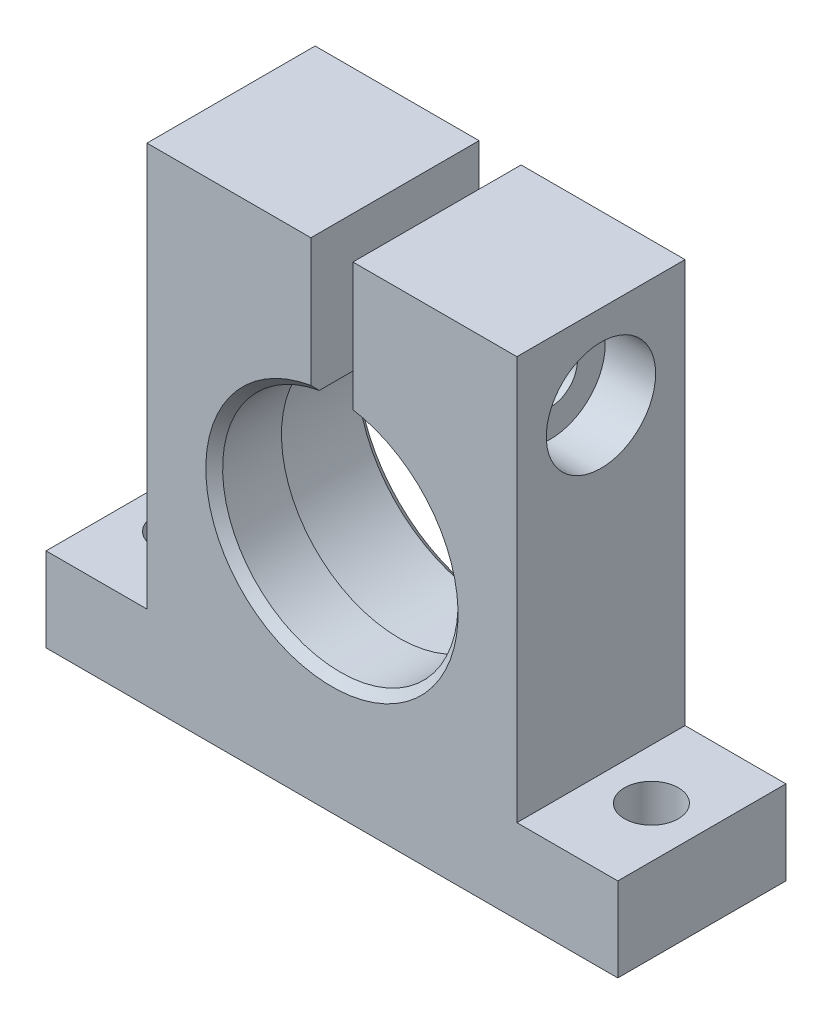
ISO-10303-21;
HEADER;
FILE_DESCRIPTION(('STEP AP214'),'2;1');
FILE_NAME('part.step','',(''),(''),'','','');
FILE_SCHEMA(('AUTOMOTIVE_DESIGN { 1 0 10303 214 1 1 1 1 }'));
ENDSEC;
DATA;
#1=APPLICATION_CONTEXT('core data for automotive mechanical design processes');
#2=APPLICATION_PROTOCOL_DEFINITION('international standard','automotive_design',2000,#1);
#3=PRODUCT_CONTEXT('',#1,'mechanical');
#4=PRODUCT('Part','Part','',(#3));
#5=PRODUCT_RELATED_PRODUCT_CATEGORY('part','',(#4));
#6=PRODUCT_DEFINITION_FORMATION('','',#4);
#7=PRODUCT_DEFINITION_CONTEXT('part definition',#1,'design');
#8=PRODUCT_DEFINITION('design','',#6,#7);
#9=PRODUCT_DEFINITION_SHAPE('','',#8);
#10=(LENGTH_UNIT() NAMED_UNIT(*) SI_UNIT(.MILLI.,.METRE.));
#11=(NAMED_UNIT(*) PLANE_ANGLE_UNIT() SI_UNIT($,.RADIAN.));
#12=(NAMED_UNIT(*) SI_UNIT($,.STERADIAN.) SOLID_ANGLE_UNIT());
#13=UNCERTAINTY_MEASURE_WITH_UNIT(LENGTH_MEASURE(1.E-05),#10,'distance_accuracy_value','');
#14=(GEOMETRIC_REPRESENTATION_CONTEXT(3) GLOBAL_UNCERTAINTY_ASSIGNED_CONTEXT((#13)) GLOBAL_UNIT_ASSIGNED_CONTEXT((#10,
#11,#12)) REPRESENTATION_CONTEXT('',''));
#15=CARTESIAN_POINT('',(0.,0.,0.));
#16=DIRECTION('',(0.,0.,1.));
#17=DIRECTION('',(1.,0.,0.));
#18=AXIS2_PLACEMENT_3D('',#15,#16,#17);
#19=CARTESIAN_POINT('',(11.,15.,5.));
#20=DIRECTION('',(0.,-1.,0.));
#21=DIRECTION('',(1.,0.,0.));
#22=AXIS2_PLACEMENT_3D('',#19,#20,#21);
#23=PLANE('',#22);
#24=DIRECTION('',(-1.,0.,0.));
#25=VECTOR('',#24,1.);
#26=CARTESIAN_POINT('',(11.,15.,5.));
#27=LINE('',#26,#25);
#28=CARTESIAN_POINT('',(-1.25,15.,5.));
#29=VERTEX_POINT('',#28);
#30=CARTESIAN_POINT('',(-11.,15.,5.));
#31=VERTEX_POINT('',#30);
#32=EDGE_CURVE('E387',#29,#31,#27,.T.);
#33=ORIENTED_EDGE('',*,*,#32,.F.);
#34=DIRECTION('',(0.,0.,1.));
#35=VECTOR('',#34,1.);
#36=CARTESIAN_POINT('',(-1.25,15.,-5.));
#37=LINE('',#36,#35);
#38=CARTESIAN_POINT('',(-1.25,15.,-5.));
#39=VERTEX_POINT('',#38);
#40=EDGE_CURVE('E172',#39,#29,#37,.T.);
#41=ORIENTED_EDGE('',*,*,#40,.F.);
#42=DIRECTION('',(-1.,0.,0.));
#43=VECTOR('',#42,1.);
#44=CARTESIAN_POINT('',(11.,15.,-5.));
#45=LINE('',#44,#43);
#46=CARTESIAN_POINT('',(-11.,15.,-5.));
#47=VERTEX_POINT('',#46);
#48=EDGE_CURVE('E179',#39,#47,#45,.T.);
#49=ORIENTED_EDGE('',*,*,#48,.T.);
#50=DIRECTION('',(0.,0.,-1.));
#51=VECTOR('',#50,1.);
#52=CARTESIAN_POINT('',(-11.,15.,5.));
#53=LINE('',#52,#51);
#54=EDGE_CURVE('E188',#31,#47,#53,.T.);
#55=ORIENTED_EDGE('',*,*,#54,.F.);
#56=EDGE_LOOP('',(#33,#41,#49,#55));
#57=FACE_BOUND('',#56,.T.);
#58=ADVANCED_FACE('F43',(#57),#23,.F.);
#59=CARTESIAN_POINT('',(-11.,-14.,5.));
#60=DIRECTION('',(1.,0.,0.));
#61=DIRECTION('',(0.,0.,-1.));
#62=AXIS2_PLACEMENT_3D('',#59,#60,#61);
#63=PLANE('',#62);
#64=CARTESIAN_POINT('',(-11.,10.,0.));
#65=DIRECTION('',(1.,0.,0.));
#66=DIRECTION('',(0.,0.,-1.));
#67=AXIS2_PLACEMENT_3D('',#64,#65,#66);
#68=CIRCLE('',#67,1.75);
#69=CARTESIAN_POINT('',(-11.,10.,-1.75));
#70=VERTEX_POINT('',#69);
#71=EDGE_CURVE('E201',#70,#70,#68,.T.);
#72=ORIENTED_EDGE('',*,*,#71,.T.);
#73=EDGE_LOOP('',(#72));
#74=FACE_BOUND('',#73,.T.);
#75=DIRECTION('',(0.,0.,-1.));
#76=VECTOR('',#75,1.);
#77=CARTESIAN_POINT('',(-11.,-9.,5.));
#78=LINE('',#77,#76);
#79=CARTESIAN_POINT('',(-11.,-9.,5.));
#80=VERTEX_POINT('',#79);
#81=CARTESIAN_POINT('',(-11.,-9.,-5.));
#82=VERTEX_POINT('',#81);
#83=EDGE_CURVE('E381',#80,#82,#78,.T.);
#84=ORIENTED_EDGE('',*,*,#83,.F.);
#85=DIRECTION('',(0.,-1.,0.));
#86=VECTOR('',#85,1.);
#87=CARTESIAN_POINT('',(-11.,-14.,5.));
#88=LINE('',#87,#86);
#89=EDGE_CURVE('E178',#31,#80,#88,.T.);
#90=ORIENTED_EDGE('',*,*,#89,.F.);
#91=ORIENTED_EDGE('',*,*,#54,.T.);
#92=DIRECTION('',(0.,-1.,0.));
#93=VECTOR('',#92,1.);
#94=CARTESIAN_POINT('',(-11.,-14.,-5.));
#95=LINE('',#94,#93);
#96=EDGE_CURVE('E382',#47,#82,#95,.T.);
#97=ORIENTED_EDGE('',*,*,#96,.T.);
#98=EDGE_LOOP('',(#84,#90,#91,#97));
#99=FACE_BOUND('',#98,.T.);
#100=ADVANCED_FACE('F275',(#74,#99),#63,.F.);
#101=CARTESIAN_POINT('',(11.,-14.,5.));
#102=DIRECTION('',(-1.,0.,0.));
#103=DIRECTION('',(0.,0.,1.));
#104=AXIS2_PLACEMENT_3D('',#101,#102,#103);
#105=PLANE('',#104);
#106=CARTESIAN_POINT('',(11.,10.,0.));
#107=DIRECTION('',(1.,0.,0.));
#108=DIRECTION('',(0.,0.,-1.));
#109=AXIS2_PLACEMENT_3D('',#106,#107,#108);
#110=CIRCLE('',#109,3.25);
#111=CARTESIAN_POINT('',(11.,10.,-3.25));
#112=VERTEX_POINT('',#111);
#113=EDGE_CURVE('E438',#112,#112,#110,.T.);
#114=ORIENTED_EDGE('',*,*,#113,.F.);
#115=EDGE_LOOP('',(#114));
#116=FACE_BOUND('',#115,.T.);
#117=DIRECTION('',(0.,0.,1.));
#118=VECTOR('',#117,1.);
#119=CARTESIAN_POINT('',(11.,-9.,5.));
#120=LINE('',#119,#118);
#121=CARTESIAN_POINT('',(11.,-9.,-5.));
#122=VERTEX_POINT('',#121);
#123=CARTESIAN_POINT('',(11.,-9.,5.));
#124=VERTEX_POINT('',#123);
#125=EDGE_CURVE('E370',#122,#124,#120,.T.);
#126=ORIENTED_EDGE('',*,*,#125,.F.);
#127=DIRECTION('',(0.,1.,0.));
#128=VECTOR('',#127,1.);
#129=CARTESIAN_POINT('',(11.,-14.,-5.));
#130=LINE('',#129,#128);
#131=CARTESIAN_POINT('',(11.,15.,-5.));
#132=VERTEX_POINT('',#131);
#133=EDGE_CURVE('E184',#122,#132,#130,.T.);
#134=ORIENTED_EDGE('',*,*,#133,.T.);
#135=DIRECTION('',(0.,0.,-1.));
#136=VECTOR('',#135,1.);
#137=CARTESIAN_POINT('',(11.,15.,5.));
#138=LINE('',#137,#136);
#139=CARTESIAN_POINT('',(11.,15.,5.));
#140=VERTEX_POINT('',#139);
#141=EDGE_CURVE('E177',#140,#132,#138,.T.);
#142=ORIENTED_EDGE('',*,*,#141,.F.);
#143=DIRECTION('',(0.,1.,0.));
#144=VECTOR('',#143,1.);
#145=CARTESIAN_POINT('',(11.,-14.,5.));
#146=LINE('',#145,#144);
#147=EDGE_CURVE('E385',#124,#140,#146,.T.);
#148=ORIENTED_EDGE('',*,*,#147,.F.);
#149=EDGE_LOOP('',(#126,#134,#142,#148));
#150=FACE_BOUND('',#149,.T.);
#151=ADVANCED_FACE('F272',(#116,#150),#105,.F.);
#152=CARTESIAN_POINT('',(11.,-14.,5.));
#153=DIRECTION('',(0.,1.,0.));
#154=DIRECTION('',(-1.,0.,0.));
#155=AXIS2_PLACEMENT_3D('',#152,#153,#154);
#156=PLANE('',#155);
#157=CARTESIAN_POINT('',(-14.,-14.,0.));
#158=DIRECTION('',(0.,1.,0.));
#159=DIRECTION('',(0.,0.,1.));
#160=AXIS2_PLACEMENT_3D('',#157,#158,#159);
#161=CIRCLE('',#160,1.6);
#162=CARTESIAN_POINT('',(-14.,-14.,1.6));
#163=VERTEX_POINT('',#162);
#164=EDGE_CURVE('E332',#163,#163,#161,.T.);
#165=ORIENTED_EDGE('',*,*,#164,.T.);
#166=EDGE_LOOP('',(#165));
#167=FACE_BOUND('',#166,.T.);
#168=CARTESIAN_POINT('',(14.,-14.,0.));
#169=DIRECTION('',(0.,1.,0.));
#170=DIRECTION('',(0.,0.,1.));
#171=AXIS2_PLACEMENT_3D('',#168,#169,#170);
#172=CIRCLE('',#171,1.6);
#173=CARTESIAN_POINT('',(14.,-14.,1.6));
#174=VERTEX_POINT('',#173);
#175=EDGE_CURVE('E338',#174,#174,#172,.T.);
#176=ORIENTED_EDGE('',*,*,#175,.T.);
#177=EDGE_LOOP('',(#176));
#178=FACE_BOUND('',#177,.T.);
#179=DIRECTION('',(1.,0.,0.));
#180=VECTOR('',#179,1.);
#181=CARTESIAN_POINT('',(11.,-14.,-5.));
#182=LINE('',#181,#180);
#183=CARTESIAN_POINT('',(-17.,-14.,-5.));
#184=VERTEX_POINT('',#183);
#185=CARTESIAN_POINT('',(17.,-14.,-5.));
#186=VERTEX_POINT('',#185);
#187=EDGE_CURVE('E390',#184,#186,#182,.T.);
#188=ORIENTED_EDGE('',*,*,#187,.T.);
#189=DIRECTION('',(0.,0.,1.));
#190=VECTOR('',#189,1.);
#191=CARTESIAN_POINT('',(17.,-14.,-5.));
#192=LINE('',#191,#190);
#193=CARTESIAN_POINT('',(17.,-14.,5.));
#194=VERTEX_POINT('',#193);
#195=EDGE_CURVE('E351',#186,#194,#192,.T.);
#196=ORIENTED_EDGE('',*,*,#195,.T.);
#197=DIRECTION('',(1.,0.,0.));
#198=VECTOR('',#197,1.);
#199=CARTESIAN_POINT('',(11.,-14.,5.));
#200=LINE('',#199,#198);
#201=CARTESIAN_POINT('',(-17.,-14.,5.));
#202=VERTEX_POINT('',#201);
#203=EDGE_CURVE('E182',#202,#194,#200,.T.);
#204=ORIENTED_EDGE('',*,*,#203,.F.);
#205=DIRECTION('',(0.,0.,-1.));
#206=VECTOR('',#205,1.);
#207=CARTESIAN_POINT('',(-17.,-14.,-5.));
#208=LINE('',#207,#206);
#209=EDGE_CURVE('E346',#202,#184,#208,.T.);
#210=ORIENTED_EDGE('',*,*,#209,.T.);
#211=EDGE_LOOP('',(#188,#196,#204,#210));
#212=FACE_BOUND('',#211,.T.);
#213=ADVANCED_FACE('F271',(#167,#178,#212),#156,.F.);
#214=CARTESIAN_POINT('',(1.25,15.,-5.));
#215=VERTEX_POINT('',#214);
#216=EDGE_CURVE('E160',#132,#215,#45,.T.);
#217=ORIENTED_EDGE('',*,*,#216,.T.);
#218=DIRECTION('',(0.,0.,1.));
#219=VECTOR('',#218,1.);
#220=CARTESIAN_POINT('',(1.25,15.,-5.));
#221=LINE('',#220,#219);
#222=CARTESIAN_POINT('',(1.25,15.,5.));
#223=VERTEX_POINT('',#222);
#224=EDGE_CURVE('E161',#215,#223,#221,.T.);
#225=ORIENTED_EDGE('',*,*,#224,.T.);
#226=EDGE_CURVE('E191',#140,#223,#27,.T.);
#227=ORIENTED_EDGE('',*,*,#226,.F.);
#228=ORIENTED_EDGE('',*,*,#141,.T.);
#229=EDGE_LOOP('',(#217,#225,#227,#228));
#230=FACE_BOUND('',#229,.T.);
#231=ADVANCED_FACE('F175',(#230),#23,.F.);
#232=CARTESIAN_POINT('',(0.,0.,5.));
#233=DIRECTION('',(0.,0.,1.));
#234=DIRECTION('',(1.,0.,0.));
#235=AXIS2_PLACEMENT_3D('',#232,#233,#234);
#236=PLANE('',#235);
#237=DIRECTION('',(0.,1.,0.));
#238=VECTOR('',#237,1.);
#239=CARTESIAN_POINT('',(1.25,6.88748865697795,5.));
#240=LINE('',#239,#238);
#241=CARTESIAN_POINT('',(1.25,7.39509972887451,5.));
#242=VERTEX_POINT('',#241);
#243=EDGE_CURVE('E168',#242,#223,#240,.T.);
#244=ORIENTED_EDGE('',*,*,#243,.F.);
#245=CARTESIAN_POINT('',(0.,0.,5.));
#246=DIRECTION('',(0.,0.,1.));
#247=DIRECTION('',(1.,0.,0.));
#248=AXIS2_PLACEMENT_3D('',#245,#246,#247);
#249=CIRCLE('',#248,7.49999999999999);
#250=CARTESIAN_POINT('',(-1.25,7.39509972887451,5.));
#251=VERTEX_POINT('',#250);
#252=EDGE_CURVE('E204',#242,#251,#249,.F.);
#253=ORIENTED_EDGE('',*,*,#252,.T.);
#254=DIRECTION('',(0.,-1.,0.));
#255=VECTOR('',#254,1.);
#256=CARTESIAN_POINT('',(-1.25,6.88748865697795,5.));
#257=LINE('',#256,#255);
#258=EDGE_CURVE('E417',#29,#251,#257,.T.);
#259=ORIENTED_EDGE('',*,*,#258,.F.);
#260=ORIENTED_EDGE('',*,*,#32,.T.);
#261=ORIENTED_EDGE('',*,*,#89,.T.);
#262=DIRECTION('',(-1.,0.,0.));
#263=VECTOR('',#262,1.);
#264=CARTESIAN_POINT('',(17.,-9.,5.));
#265=LINE('',#264,#263);
#266=CARTESIAN_POINT('',(-17.,-9.,5.));
#267=VERTEX_POINT('',#266);
#268=EDGE_CURVE('E358',#80,#267,#265,.T.);
#269=ORIENTED_EDGE('',*,*,#268,.T.);
#270=DIRECTION('',(0.,-1.,0.));
#271=VECTOR('',#270,1.);
#272=CARTESIAN_POINT('',(-17.,-9.,5.));
#273=LINE('',#272,#271);
#274=EDGE_CURVE('E367',#267,#202,#273,.T.);
#275=ORIENTED_EDGE('',*,*,#274,.T.);
#276=ORIENTED_EDGE('',*,*,#203,.T.);
#277=DIRECTION('',(0.,-1.,0.));
#278=VECTOR('',#277,1.);
#279=CARTESIAN_POINT('',(17.,-9.,5.));
#280=LINE('',#279,#278);
#281=CARTESIAN_POINT('',(17.,-9.,5.));
#282=VERTEX_POINT('',#281);
#283=EDGE_CURVE('E371',#282,#194,#280,.T.);
#284=ORIENTED_EDGE('',*,*,#283,.F.);
#285=EDGE_CURVE('E359',#282,#124,#265,.T.);
#286=ORIENTED_EDGE('',*,*,#285,.T.);
#287=ORIENTED_EDGE('',*,*,#147,.T.);
#288=ORIENTED_EDGE('',*,*,#226,.T.);
#289=EDGE_LOOP('',(#244,#253,#259,#260,#261,#269,#275,#276,#284,#286,#287,#288));
#290=FACE_BOUND('',#289,.T.);
#291=ADVANCED_FACE('F263',(#290),#236,.T.);
#292=CARTESIAN_POINT('',(0.,0.,-5.));
#293=DIRECTION('',(0.,0.,1.));
#294=DIRECTION('',(1.,0.,0.));
#295=AXIS2_PLACEMENT_3D('',#292,#293,#294);
#296=PLANE('',#295);
#297=DIRECTION('',(0.,-1.,0.));
#298=VECTOR('',#297,1.);
#299=CARTESIAN_POINT('',(-1.25,6.88748865697795,-5.));
#300=LINE('',#299,#298);
#301=CARTESIAN_POINT('',(-1.25,8.4075858604001,-5.));
#302=VERTEX_POINT('',#301);
#303=EDGE_CURVE('E162',#39,#302,#300,.T.);
#304=ORIENTED_EDGE('',*,*,#303,.T.);
#305=CARTESIAN_POINT('',(0.,0.,-5.));
#306=DIRECTION('',(0.,0.,1.));
#307=DIRECTION('',(1.,0.,0.));
#308=AXIS2_PLACEMENT_3D('',#305,#306,#307);
#309=CIRCLE('',#308,8.49999999999999);
#310=CARTESIAN_POINT('',(1.25,8.4075858604001,-5.));
#311=VERTEX_POINT('',#310);
#312=EDGE_CURVE('E11',#302,#311,#309,.T.);
#313=ORIENTED_EDGE('',*,*,#312,.T.);
#314=DIRECTION('',(0.,1.,0.));
#315=VECTOR('',#314,1.);
#316=CARTESIAN_POINT('',(1.25,6.88748865697795,-5.));
#317=LINE('',#316,#315);
#318=EDGE_CURVE('E155',#311,#215,#317,.T.);
#319=ORIENTED_EDGE('',*,*,#318,.T.);
#320=ORIENTED_EDGE('',*,*,#216,.F.);
#321=ORIENTED_EDGE('',*,*,#133,.F.);
#322=DIRECTION('',(1.,0.,0.));
#323=VECTOR('',#322,1.);
#324=CARTESIAN_POINT('',(17.,-9.,-5.));
#325=LINE('',#324,#323);
#326=CARTESIAN_POINT('',(17.,-9.,-5.));
#327=VERTEX_POINT('',#326);
#328=EDGE_CURVE('E350',#122,#327,#325,.T.);
#329=ORIENTED_EDGE('',*,*,#328,.T.);
#330=DIRECTION('',(0.,-1.,0.));
#331=VECTOR('',#330,1.);
#332=CARTESIAN_POINT('',(17.,-9.,-5.));
#333=LINE('',#332,#331);
#334=EDGE_CURVE('E374',#327,#186,#333,.T.);
#335=ORIENTED_EDGE('',*,*,#334,.T.);
#336=ORIENTED_EDGE('',*,*,#187,.F.);
#337=DIRECTION('',(0.,-1.,0.));
#338=VECTOR('',#337,1.);
#339=CARTESIAN_POINT('',(-17.,-9.,-5.));
#340=LINE('',#339,#338);
#341=CARTESIAN_POINT('',(-17.,-9.,-5.));
#342=VERTEX_POINT('',#341);
#343=EDGE_CURVE('E362',#342,#184,#340,.T.);
#344=ORIENTED_EDGE('',*,*,#343,.F.);
#345=EDGE_CURVE('E352',#342,#82,#325,.T.);
#346=ORIENTED_EDGE('',*,*,#345,.T.);
#347=ORIENTED_EDGE('',*,*,#96,.F.);
#348=ORIENTED_EDGE('',*,*,#48,.F.);
#349=EDGE_LOOP('',(#304,#313,#319,#320,#321,#329,#335,#336,#344,#346,#347,#348));
#350=FACE_BOUND('',#349,.T.);
#351=ADVANCED_FACE('F157',(#350),#296,.F.);
#352=CARTESIAN_POINT('',(17.,-9.,-5.));
#353=DIRECTION('',(1.,0.,0.));
#354=DIRECTION('',(0.,1.,0.));
#355=AXIS2_PLACEMENT_3D('',#352,#353,#354);
#356=PLANE('',#355);
#357=ORIENTED_EDGE('',*,*,#195,.F.);
#358=ORIENTED_EDGE('',*,*,#334,.F.);
#359=DIRECTION('',(0.,0.,1.));
#360=VECTOR('',#359,1.);
#361=CARTESIAN_POINT('',(17.,-9.,-5.));
#362=LINE('',#361,#360);
#363=EDGE_CURVE('E355',#327,#282,#362,.T.);
#364=ORIENTED_EDGE('',*,*,#363,.T.);
#365=ORIENTED_EDGE('',*,*,#283,.T.);
#366=EDGE_LOOP('',(#357,#358,#364,#365));
#367=FACE_BOUND('',#366,.T.);
#368=ADVANCED_FACE('F256',(#367),#356,.T.);
#369=CARTESIAN_POINT('',(0.,-9.,0.));
#370=DIRECTION('',(0.,-1.,0.));
#371=DIRECTION('',(1.,0.,0.));
#372=AXIS2_PLACEMENT_3D('',#369,#370,#371);
#373=PLANE('',#372);
#374=CARTESIAN_POINT('',(14.,-9.,0.));
#375=DIRECTION('',(0.,1.,0.));
#376=DIRECTION('',(0.,0.,1.));
#377=AXIS2_PLACEMENT_3D('',#374,#375,#376);
#378=CIRCLE('',#377,1.6);
#379=CARTESIAN_POINT('',(14.,-9.,1.6));
#380=VERTEX_POINT('',#379);
#381=EDGE_CURVE('E335',#380,#380,#378,.T.);
#382=ORIENTED_EDGE('',*,*,#381,.F.);
#383=EDGE_LOOP('',(#382));
#384=FACE_BOUND('',#383,.T.);
#385=ORIENTED_EDGE('',*,*,#328,.F.);
#386=ORIENTED_EDGE('',*,*,#125,.T.);
#387=ORIENTED_EDGE('',*,*,#285,.F.);
#388=ORIENTED_EDGE('',*,*,#363,.F.);
#389=EDGE_LOOP('',(#385,#386,#387,#388));
#390=FACE_BOUND('',#389,.T.);
#391=ADVANCED_FACE('F254',(#384,#390),#373,.F.);
#392=CARTESIAN_POINT('',(-14.,-9.,0.));
#393=DIRECTION('',(0.,1.,0.));
#394=DIRECTION('',(0.,0.,1.));
#395=AXIS2_PLACEMENT_3D('',#392,#393,#394);
#396=CIRCLE('',#395,1.6);
#397=CARTESIAN_POINT('',(-14.,-9.,1.6));
#398=VERTEX_POINT('',#397);
#399=EDGE_CURVE('E324',#398,#398,#396,.T.);
#400=ORIENTED_EDGE('',*,*,#399,.F.);
#401=EDGE_LOOP('',(#400));
#402=FACE_BOUND('',#401,.T.);
#403=ORIENTED_EDGE('',*,*,#268,.F.);
#404=ORIENTED_EDGE('',*,*,#83,.T.);
#405=ORIENTED_EDGE('',*,*,#345,.F.);
#406=DIRECTION('',(0.,0.,-1.));
#407=VECTOR('',#406,1.);
#408=CARTESIAN_POINT('',(-17.,-9.,-5.));
#409=LINE('',#408,#407);
#410=EDGE_CURVE('E347',#267,#342,#409,.T.);
#411=ORIENTED_EDGE('',*,*,#410,.F.);
#412=EDGE_LOOP('',(#403,#404,#405,#411));
#413=FACE_BOUND('',#412,.T.);
#414=ADVANCED_FACE('F251',(#402,#413),#373,.F.);
#415=CARTESIAN_POINT('',(-17.,-9.,-5.));
#416=DIRECTION('',(-1.,0.,0.));
#417=DIRECTION('',(0.,-1.,0.));
#418=AXIS2_PLACEMENT_3D('',#415,#416,#417);
#419=PLANE('',#418);
#420=ORIENTED_EDGE('',*,*,#209,.F.);
#421=ORIENTED_EDGE('',*,*,#274,.F.);
#422=ORIENTED_EDGE('',*,*,#410,.T.);
#423=ORIENTED_EDGE('',*,*,#343,.T.);
#424=EDGE_LOOP('',(#420,#421,#422,#423));
#425=FACE_BOUND('',#424,.T.);
#426=ADVANCED_FACE('F249',(#425),#419,.T.);
#427=CARTESIAN_POINT('',(0.,0.,1.));
#428=DIRECTION('',(0.,0.,1.));
#429=DIRECTION('',(1.,0.,0.));
#430=AXIS2_PLACEMENT_3D('',#427,#428,#429);
#431=PLANE('',#430);
#432=CARTESIAN_POINT('',(0.,0.,1.));
#433=DIRECTION('',(0.,0.,-1.));
#434=DIRECTION('',(-1.,0.,0.));
#435=AXIS2_PLACEMENT_3D('',#432,#433,#434);
#436=CIRCLE('',#435,8.);
#437=CARTESIAN_POINT('',(1.25,7.90174031463955,1.));
#438=VERTEX_POINT('',#437);
#439=CARTESIAN_POINT('',(-1.25,7.90174031463955,1.));
#440=VERTEX_POINT('',#439);
#441=EDGE_CURVE('E344',#438,#440,#436,.T.);
#442=ORIENTED_EDGE('',*,*,#441,.T.);
#443=DIRECTION('',(0.,-1.,0.));
#444=VECTOR('',#443,1.);
#445=CARTESIAN_POINT('',(-1.25,0.,1.));
#446=LINE('',#445,#444);
#447=CARTESIAN_POINT('',(-1.25,6.88748865697795,1.));
#448=VERTEX_POINT('',#447);
#449=EDGE_CURVE('E320',#440,#448,#446,.T.);
#450=ORIENTED_EDGE('',*,*,#449,.T.);
#451=CARTESIAN_POINT('',(0.,0.,1.));
#452=DIRECTION('',(0.,0.,-1.));
#453=DIRECTION('',(-1.,0.,0.));
#454=AXIS2_PLACEMENT_3D('',#451,#452,#453);
#455=CIRCLE('',#454,7.);
#456=CARTESIAN_POINT('',(1.25,6.88748865697796,1.));
#457=VERTEX_POINT('',#456);
#458=EDGE_CURVE('E341',#457,#448,#455,.T.);
#459=ORIENTED_EDGE('',*,*,#458,.F.);
#460=DIRECTION('',(0.,1.,0.));
#461=VECTOR('',#460,1.);
#462=CARTESIAN_POINT('',(1.25,0.,1.));
#463=LINE('',#462,#461);
#464=EDGE_CURVE('E322',#457,#438,#463,.T.);
#465=ORIENTED_EDGE('',*,*,#464,.T.);
#466=EDGE_LOOP('',(#442,#450,#459,#465));
#467=FACE_BOUND('',#466,.T.);
#468=ADVANCED_FACE('F245',(#467),#431,.F.);
#469=CARTESIAN_POINT('',(0.,0.,-5.));
#470=DIRECTION('',(0.,0.,-1.));
#471=DIRECTION('',(-1.,0.,0.));
#472=AXIS2_PLACEMENT_3D('',#469,#470,#471);
#473=CYLINDRICAL_SURFACE('',#472,7.99999999999999);
#474=DIRECTION('',(0.,0.,-1.));
#475=VECTOR('',#474,1.);
#476=CARTESIAN_POINT('',(1.25,7.90174031463955,-5.));
#477=LINE('',#476,#475);
#478=CARTESIAN_POINT('',(1.25,7.90174031463955,-4.50000000000001));
#479=VERTEX_POINT('',#478);
#480=EDGE_CURVE('E315',#438,#479,#477,.T.);
#481=ORIENTED_EDGE('',*,*,#480,.T.);
#482=CARTESIAN_POINT('',(0.,0.,-4.50000000000001));
#483=DIRECTION('',(0.,0.,1.));
#484=DIRECTION('',(1.,0.,0.));
#485=AXIS2_PLACEMENT_3D('',#482,#483,#484);
#486=CIRCLE('',#485,7.99999999999999);
#487=CARTESIAN_POINT('',(-1.25,7.90174031463955,-4.50000000000001));
#488=VERTEX_POINT('',#487);
#489=EDGE_CURVE('E53',#479,#488,#486,.F.);
#490=ORIENTED_EDGE('',*,*,#489,.T.);
#491=DIRECTION('',(0.,0.,-1.));
#492=VECTOR('',#491,1.);
#493=CARTESIAN_POINT('',(-1.25,7.90174031463955,-5.));
#494=LINE('',#493,#492);
#495=EDGE_CURVE('E313',#488,#440,#494,.F.);
#496=ORIENTED_EDGE('',*,*,#495,.T.);
#497=ORIENTED_EDGE('',*,*,#441,.F.);
#498=EDGE_LOOP('',(#481,#490,#496,#497));
#499=FACE_BOUND('',#498,.T.);
#500=ADVANCED_FACE('F241',(#499),#473,.F.);
#501=CARTESIAN_POINT('',(0.,0.,1.));
#502=DIRECTION('',(0.,0.,-1.));
#503=DIRECTION('',(-1.,0.,0.));
#504=AXIS2_PLACEMENT_3D('',#501,#502,#503);
#505=CYLINDRICAL_SURFACE('',#504,7.);
#506=DIRECTION('',(0.,0.,-1.));
#507=VECTOR('',#506,1.);
#508=CARTESIAN_POINT('',(-1.25,6.88748865697795,1.));
#509=LINE('',#508,#507);
#510=CARTESIAN_POINT('',(-1.25,6.88748865697795,4.50000000000001));
#511=VERTEX_POINT('',#510);
#512=EDGE_CURVE('E195',#448,#511,#509,.F.);
#513=ORIENTED_EDGE('',*,*,#512,.T.);
#514=CARTESIAN_POINT('',(0.,0.,4.50000000000001));
#515=DIRECTION('',(0.,0.,1.));
#516=DIRECTION('',(1.,0.,0.));
#517=AXIS2_PLACEMENT_3D('',#514,#515,#516);
#518=CIRCLE('',#517,7.);
#519=CARTESIAN_POINT('',(1.25,6.88748865697795,4.50000000000001));
#520=VERTEX_POINT('',#519);
#521=EDGE_CURVE('E414',#511,#520,#518,.T.);
#522=ORIENTED_EDGE('',*,*,#521,.T.);
#523=DIRECTION('',(0.,0.,-1.));
#524=VECTOR('',#523,1.);
#525=CARTESIAN_POINT('',(1.25,6.88748865697795,1.));
#526=LINE('',#525,#524);
#527=EDGE_CURVE('E193',#520,#457,#526,.T.);
#528=ORIENTED_EDGE('',*,*,#527,.T.);
#529=ORIENTED_EDGE('',*,*,#458,.T.);
#530=EDGE_LOOP('',(#513,#522,#528,#529));
#531=FACE_BOUND('',#530,.T.);
#532=ADVANCED_FACE('F237',(#531),#505,.F.);
#533=CARTESIAN_POINT('',(14.,-9.,0.));
#534=DIRECTION('',(0.,1.,0.));
#535=DIRECTION('',(0.,0.,1.));
#536=AXIS2_PLACEMENT_3D('',#533,#534,#535);
#537=CYLINDRICAL_SURFACE('',#536,1.6);
#538=ORIENTED_EDGE('',*,*,#175,.F.);
#539=EDGE_LOOP('',(#538));
#540=FACE_BOUND('',#539,.T.);
#541=ORIENTED_EDGE('',*,*,#381,.T.);
#542=EDGE_LOOP('',(#541));
#543=FACE_BOUND('',#542,.T.);
#544=ADVANCED_FACE('F233',(#540,#543),#537,.F.);
#545=CARTESIAN_POINT('',(-14.,-9.,0.));
#546=DIRECTION('',(0.,1.,0.));
#547=DIRECTION('',(0.,0.,1.));
#548=AXIS2_PLACEMENT_3D('',#545,#546,#547);
#549=CYLINDRICAL_SURFACE('',#548,1.6);
#550=ORIENTED_EDGE('',*,*,#164,.F.);
#551=EDGE_LOOP('',(#550));
#552=FACE_BOUND('',#551,.T.);
#553=ORIENTED_EDGE('',*,*,#399,.T.);
#554=EDGE_LOOP('',(#553));
#555=FACE_BOUND('',#554,.T.);
#556=ADVANCED_FACE('F229',(#552,#555),#549,.F.);
#557=CARTESIAN_POINT('',(1.25,6.88748865697795,-5.));
#558=DIRECTION('',(1.,0.,0.));
#559=DIRECTION('',(0.,0.,-1.));
#560=AXIS2_PLACEMENT_3D('',#557,#558,#559);
#561=PLANE('',#560);
#562=CARTESIAN_POINT('',(1.25,10.,0.));
#563=DIRECTION('',(1.,0.,0.));
#564=DIRECTION('',(0.,0.,-1.));
#565=AXIS2_PLACEMENT_3D('',#562,#563,#564);
#566=CIRCLE('',#565,1.6);
#567=CARTESIAN_POINT('',(1.25,10.,-1.6));
#568=VERTEX_POINT('',#567);
#569=EDGE_CURVE('E429',#568,#568,#566,.T.);
#570=ORIENTED_EDGE('',*,*,#569,.T.);
#571=EDGE_LOOP('',(#570));
#572=FACE_BOUND('',#571,.T.);
#573=ORIENTED_EDGE('',*,*,#527,.F.);
#574=CARTESIAN_POINT('',(1.25,6.88748865697795,4.50000000000001));
#575=CARTESIAN_POINT('',(1.25,6.97213457218941,4.58328859300769));
#576=CARTESIAN_POINT('',(1.25,7.05675845255511,4.6665995562787));
#577=CARTESIAN_POINT('',(1.25,7.22596214318709,4.83326622294558));
#578=CARTESIAN_POINT('',(1.25,7.31054195345357,4.91662192634123));
#579=CARTESIAN_POINT('',(1.25,7.39509972887451,5.));
#580=B_SPLINE_CURVE_WITH_KNOTS('',3,(#574,#575,#576,#577,#578,#579),.UNSPECIFIED.,.F.,.F.,(4,2,
4),(0.,0.356254487078614,0.712508972439388),.UNSPECIFIED.);
#581=EDGE_CURVE('E299',#520,#242,#580,.T.);
#582=ORIENTED_EDGE('',*,*,#581,.T.);
#583=ORIENTED_EDGE('',*,*,#243,.T.);
#584=ORIENTED_EDGE('',*,*,#224,.F.);
#585=ORIENTED_EDGE('',*,*,#318,.F.);
#586=CARTESIAN_POINT('',(1.25,8.4075858604001,-5.));
#587=CARTESIAN_POINT('',(1.25,8.3233079630533,-4.91663662606483));
#588=CARTESIAN_POINT('',(1.25,8.23901521894041,-4.83328827247064));
#589=CARTESIAN_POINT('',(1.25,8.07040003702028,-4.66662160580392));
#590=CARTESIAN_POINT('',(1.25,7.98607759921299,-4.58330329273145));
#591=CARTESIAN_POINT('',(1.25,7.90174031463955,-4.50000000000001));
#592=B_SPLINE_CURVE_WITH_KNOTS('',3,(#586,#587,#588,#589,#590,#591),.UNSPECIFIED.,.F.,.F.,(4,2,
4),(0.,0.355626113794366,0.711252228272866),.UNSPECIFIED.);
#593=EDGE_CURVE('E60',#311,#479,#592,.T.);
#594=ORIENTED_EDGE('',*,*,#593,.T.);
#595=ORIENTED_EDGE('',*,*,#480,.F.);
#596=ORIENTED_EDGE('',*,*,#464,.F.);
#597=EDGE_LOOP('',(#573,#582,#583,#584,#585,#594,#595,#596));
#598=FACE_BOUND('',#597,.T.);
#599=ADVANCED_FACE('F166',(#572,#598),#561,.F.);
#600=CARTESIAN_POINT('',(-1.25,6.88748865697795,-5.));
#601=DIRECTION('',(-1.,0.,0.));
#602=DIRECTION('',(0.,0.,1.));
#603=AXIS2_PLACEMENT_3D('',#600,#601,#602);
#604=PLANE('',#603);
#605=CARTESIAN_POINT('',(-1.25,10.,0.));
#606=DIRECTION('',(-1.,0.,0.));
#607=DIRECTION('',(0.,0.,1.));
#608=AXIS2_PLACEMENT_3D('',#605,#606,#607);
#609=CIRCLE('',#608,1.25);
#610=CARTESIAN_POINT('',(-1.25,10.,1.25));
#611=VERTEX_POINT('',#610);
#612=EDGE_CURVE('E423',#611,#611,#609,.T.);
#613=ORIENTED_EDGE('',*,*,#612,.T.);
#614=EDGE_LOOP('',(#613));
#615=FACE_BOUND('',#614,.T.);
#616=ORIENTED_EDGE('',*,*,#258,.T.);
#617=CARTESIAN_POINT('',(-1.25,7.39509972887451,5.));
#618=CARTESIAN_POINT('',(-1.25,7.31054195345357,4.91662192634123));
#619=CARTESIAN_POINT('',(-1.25,7.22596214318709,4.83326622294558));
#620=CARTESIAN_POINT('',(-1.25,7.05675845255511,4.6665995562787));
#621=CARTESIAN_POINT('',(-1.25,6.97213457218941,4.58328859300769));
#622=CARTESIAN_POINT('',(-1.25,6.88748865697795,4.50000000000001));
#623=B_SPLINE_CURVE_WITH_KNOTS('',3,(#617,#618,#619,#620,#621,#622),.UNSPECIFIED.,.F.,.F.,(4,2,
4),(0.,0.356254485360775,0.71250897243939),.UNSPECIFIED.);
#624=EDGE_CURVE('E214',#251,#511,#623,.T.);
#625=ORIENTED_EDGE('',*,*,#624,.T.);
#626=ORIENTED_EDGE('',*,*,#512,.F.);
#627=ORIENTED_EDGE('',*,*,#449,.F.);
#628=ORIENTED_EDGE('',*,*,#495,.F.);
#629=CARTESIAN_POINT('',(-1.25,7.90174031463955,-4.50000000000001));
#630=CARTESIAN_POINT('',(-1.25,7.98607759921298,-4.58330329273145));
#631=CARTESIAN_POINT('',(-1.25,8.07040003702028,-4.66662160580392));
#632=CARTESIAN_POINT('',(-1.25,8.23901521894041,-4.83328827247064));
#633=CARTESIAN_POINT('',(-1.25,8.3233079630533,-4.91663662606483));
#634=CARTESIAN_POINT('',(-1.25,8.4075858604001,-5.));
#635=B_SPLINE_CURVE_WITH_KNOTS('',3,(#629,#630,#631,#632,#633,#634),.UNSPECIFIED.,.F.,.F.,(4,2,
4),(0.,0.355626114478499,0.711252228272866),.UNSPECIFIED.);
#636=EDGE_CURVE('E207',#488,#302,#635,.T.);
#637=ORIENTED_EDGE('',*,*,#636,.T.);
#638=ORIENTED_EDGE('',*,*,#303,.F.);
#639=ORIENTED_EDGE('',*,*,#40,.T.);
#640=EDGE_LOOP('',(#616,#625,#626,#627,#628,#637,#638,#639));
#641=FACE_BOUND('',#640,.T.);
#642=ADVANCED_FACE('F220',(#615,#641),#604,.F.);
#643=CARTESIAN_POINT('',(-11.,10.,0.));
#644=DIRECTION('',(-1.,0.,0.));
#645=DIRECTION('',(0.,0.,1.));
#646=AXIS2_PLACEMENT_3D('',#643,#644,#645);
#647=CYLINDRICAL_SURFACE('',#646,1.25);
#648=CARTESIAN_POINT('',(-10.5,10.,0.));
#649=DIRECTION('',(1.,0.,0.));
#650=DIRECTION('',(0.,0.,-1.));
#651=AXIS2_PLACEMENT_3D('',#648,#649,#650);
#652=CIRCLE('',#651,1.25);
#653=CARTESIAN_POINT('',(-10.5,10.,-1.25));
#654=VERTEX_POINT('',#653);
#655=EDGE_CURVE('E198',#654,#654,#652,.F.);
#656=ORIENTED_EDGE('',*,*,#655,.T.);
#657=EDGE_LOOP('',(#656));
#658=FACE_BOUND('',#657,.T.);
#659=ORIENTED_EDGE('',*,*,#612,.F.);
#660=EDGE_LOOP('',(#659));
#661=FACE_BOUND('',#660,.T.);
#662=ADVANCED_FACE('F225',(#658,#661),#647,.F.);
#663=CARTESIAN_POINT('',(11.,10.,0.));
#664=DIRECTION('',(1.,0.,0.));
#665=DIRECTION('',(0.,0.,-1.));
#666=AXIS2_PLACEMENT_3D('',#663,#664,#665);
#667=CYLINDRICAL_SURFACE('',#666,1.6);
#668=ORIENTED_EDGE('',*,*,#569,.F.);
#669=EDGE_LOOP('',(#668));
#670=FACE_BOUND('',#669,.T.);
#671=CARTESIAN_POINT('',(8.,10.,0.));
#672=DIRECTION('',(1.,0.,0.));
#673=DIRECTION('',(0.,0.,-1.));
#674=AXIS2_PLACEMENT_3D('',#671,#672,#673);
#675=CIRCLE('',#674,1.6);
#676=CARTESIAN_POINT('',(8.,10.,-1.6));
#677=VERTEX_POINT('',#676);
#678=EDGE_CURVE('E432',#677,#677,#675,.T.);
#679=ORIENTED_EDGE('',*,*,#678,.T.);
#680=EDGE_LOOP('',(#679));
#681=FACE_BOUND('',#680,.T.);
#682=ADVANCED_FACE('F449',(#670,#681),#667,.F.);
#683=CARTESIAN_POINT('',(8.,11.6,0.));
#684=DIRECTION('',(-1.,0.,0.));
#685=DIRECTION('',(0.,0.,1.));
#686=AXIS2_PLACEMENT_3D('',#683,#684,#685);
#687=PLANE('',#686);
#688=ORIENTED_EDGE('',*,*,#678,.F.);
#689=EDGE_LOOP('',(#688));
#690=FACE_BOUND('',#689,.T.);
#691=CARTESIAN_POINT('',(8.,10.,0.));
#692=DIRECTION('',(1.,0.,0.));
#693=DIRECTION('',(0.,0.,-1.));
#694=AXIS2_PLACEMENT_3D('',#691,#692,#693);
#695=CIRCLE('',#694,3.25);
#696=CARTESIAN_POINT('',(8.,10.,-3.25));
#697=VERTEX_POINT('',#696);
#698=EDGE_CURVE('E435',#697,#697,#695,.T.);
#699=ORIENTED_EDGE('',*,*,#698,.T.);
#700=EDGE_LOOP('',(#699));
#701=FACE_BOUND('',#700,.T.);
#702=ADVANCED_FACE('F443',(#690,#701),#687,.F.);
#703=CARTESIAN_POINT('',(11.,10.,0.));
#704=DIRECTION('',(1.,0.,0.));
#705=DIRECTION('',(0.,0.,-1.));
#706=AXIS2_PLACEMENT_3D('',#703,#704,#705);
#707=CYLINDRICAL_SURFACE('',#706,3.25);
#708=ORIENTED_EDGE('',*,*,#698,.F.);
#709=EDGE_LOOP('',(#708));
#710=FACE_BOUND('',#709,.T.);
#711=ORIENTED_EDGE('',*,*,#113,.T.);
#712=EDGE_LOOP('',(#711));
#713=FACE_BOUND('',#712,.T.);
#714=ADVANCED_FACE('F290',(#710,#713),#707,.F.);
#715=CARTESIAN_POINT('',(-10.5,10.,0.));
#716=DIRECTION('',(-1.,0.,0.));
#717=DIRECTION('',(0.,0.,1.));
#718=AXIS2_PLACEMENT_3D('',#715,#716,#717);
#719=CONICAL_SURFACE('',#718,1.25,0.785398163397452);
#720=ORIENTED_EDGE('',*,*,#71,.F.);
#721=EDGE_LOOP('',(#720));
#722=FACE_BOUND('',#721,.T.);
#723=ORIENTED_EDGE('',*,*,#655,.F.);
#724=EDGE_LOOP('',(#723));
#725=FACE_BOUND('',#724,.T.);
#726=ADVANCED_FACE('F284',(#722,#725),#719,.F.);
#727=CARTESIAN_POINT('',(0.,0.,5.));
#728=DIRECTION('',(0.,0.,1.));
#729=DIRECTION('',(1.,0.,0.));
#730=AXIS2_PLACEMENT_3D('',#727,#728,#729);
#731=CONICAL_SURFACE('',#730,7.49999999999999,0.785398163397446);
#732=ORIENTED_EDGE('',*,*,#581,.F.);
#733=ORIENTED_EDGE('',*,*,#521,.F.);
#734=ORIENTED_EDGE('',*,*,#624,.F.);
#735=ORIENTED_EDGE('',*,*,#252,.F.);
#736=EDGE_LOOP('',(#732,#733,#734,#735));
#737=FACE_BOUND('',#736,.T.);
#738=ADVANCED_FACE('F289',(#737),#731,.F.);
#739=CARTESIAN_POINT('',(0.,0.,-4.50000000000001));
#740=DIRECTION('',(0.,0.,-1.));
#741=DIRECTION('',(-1.,0.,0.));
#742=AXIS2_PLACEMENT_3D('',#739,#740,#741);
#743=CONICAL_SURFACE('',#742,7.99999999999999,0.785398163397455);
#744=ORIENTED_EDGE('',*,*,#593,.F.);
#745=ORIENTED_EDGE('',*,*,#312,.F.);
#746=ORIENTED_EDGE('',*,*,#636,.F.);
#747=ORIENTED_EDGE('',*,*,#489,.F.);
#748=EDGE_LOOP('',(#744,#745,#746,#747));
#749=FACE_BOUND('',#748,.T.);
#750=ADVANCED_FACE('F46',(#749),#743,.F.);
#751=CLOSED_SHELL('',(#58,#100,#151,#213,#231,#291,#351,#368,#391,#414,#426,#468,#500,#532,#544,
#556,#599,#642,#662,#682,#702,#714,#726,#738,#750));
#752=MANIFOLD_SOLID_BREP('B2',#751);
#753=ADVANCED_BREP_SHAPE_REPRESENTATION('',(#18,#752),#14);
#754=SHAPE_DEFINITION_REPRESENTATION(#9,#753);
ENDSEC;
END-ISO-10303-21;
